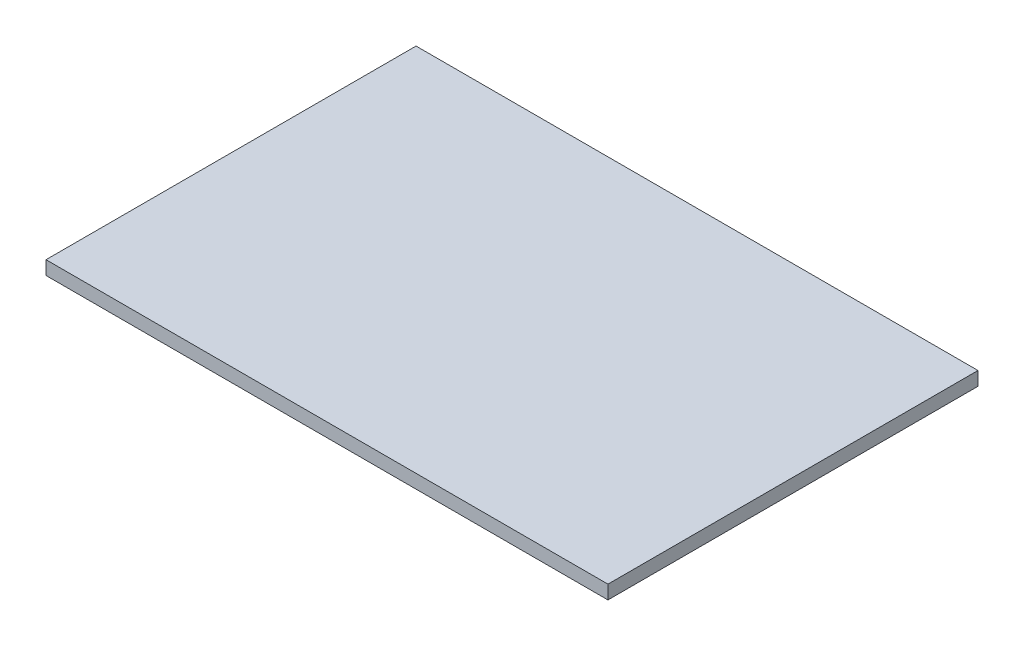
ISO-10303-21;
HEADER;
FILE_DESCRIPTION(('STEP AP214'),'2;1');
FILE_NAME('part.step','',(''),(''),'','','');
FILE_SCHEMA(('AUTOMOTIVE_DESIGN { 1 0 10303 214 1 1 1 1 }'));
ENDSEC;
DATA;
#1=APPLICATION_CONTEXT('core data for automotive mechanical design processes');
#2=APPLICATION_PROTOCOL_DEFINITION('international standard','automotive_design',2000,#1);
#3=PRODUCT_CONTEXT('',#1,'mechanical');
#4=PRODUCT('Part','Part','',(#3));
#5=PRODUCT_RELATED_PRODUCT_CATEGORY('part','',(#4));
#6=PRODUCT_DEFINITION_FORMATION('','',#4);
#7=PRODUCT_DEFINITION_CONTEXT('part definition',#1,'design');
#8=PRODUCT_DEFINITION('design','',#6,#7);
#9=PRODUCT_DEFINITION_SHAPE('','',#8);
#10=(LENGTH_UNIT() NAMED_UNIT(*) SI_UNIT(.MILLI.,.METRE.));
#11=(NAMED_UNIT(*) PLANE_ANGLE_UNIT() SI_UNIT($,.RADIAN.));
#12=(NAMED_UNIT(*) SI_UNIT($,.STERADIAN.) SOLID_ANGLE_UNIT());
#13=UNCERTAINTY_MEASURE_WITH_UNIT(LENGTH_MEASURE(1.E-05),#10,'distance_accuracy_value','');
#14=(GEOMETRIC_REPRESENTATION_CONTEXT(3) GLOBAL_UNCERTAINTY_ASSIGNED_CONTEXT((#13)) GLOBAL_UNIT_ASSIGNED_CONTEXT((#10,
#11,#12)) REPRESENTATION_CONTEXT('',''));
#15=CARTESIAN_POINT('',(0.,0.,0.));
#16=DIRECTION('',(0.,0.,1.));
#17=DIRECTION('',(1.,0.,0.));
#18=AXIS2_PLACEMENT_3D('',#15,#16,#17);
#19=CARTESIAN_POINT('',(-182.71992688712,-4.52441882508929,-124.934414280607));
#20=DIRECTION('',(1.,0.,0.));
#21=DIRECTION('',(0.,0.,-1.));
#22=AXIS2_PLACEMENT_3D('',#19,#20,#21);
#23=PLANE('',#22);
#24=DIRECTION('',(0.,0.,1.));
#25=VECTOR('',#24,1.);
#26=CARTESIAN_POINT('',(-182.71992688712,-24.5244188250893,-124.934414280607));
#27=LINE('',#26,#25);
#28=CARTESIAN_POINT('',(-182.71992688712,-24.5244188250893,-124.934414280607));
#29=VERTEX_POINT('',#28);
#30=CARTESIAN_POINT('',(-182.71992688712,-24.5244188250893,415.065585719393));
#31=VERTEX_POINT('',#30);
#32=EDGE_CURVE('E91',#29,#31,#27,.T.);
#33=ORIENTED_EDGE('',*,*,#32,.T.);
#34=DIRECTION('',(0.,-1.,0.));
#35=VECTOR('',#34,1.);
#36=CARTESIAN_POINT('',(-182.71992688712,-4.52441882508929,415.065585719393));
#37=LINE('',#36,#35);
#38=CARTESIAN_POINT('',(-182.71992688712,-4.52441882508929,415.065585719393));
#39=VERTEX_POINT('',#38);
#40=EDGE_CURVE('E11',#39,#31,#37,.T.);
#41=ORIENTED_EDGE('',*,*,#40,.F.);
#42=DIRECTION('',(0.,0.,1.));
#43=VECTOR('',#42,1.);
#44=CARTESIAN_POINT('',(-182.71992688712,-4.52441882508929,-124.934414280607));
#45=LINE('',#44,#43);
#46=CARTESIAN_POINT('',(-182.71992688712,-4.52441882508929,-124.934414280607));
#47=VERTEX_POINT('',#46);
#48=EDGE_CURVE('E101',#47,#39,#45,.T.);
#49=ORIENTED_EDGE('',*,*,#48,.F.);
#50=DIRECTION('',(0.,-1.,0.));
#51=VECTOR('',#50,1.);
#52=CARTESIAN_POINT('',(-182.71992688712,-4.52441882508929,-124.934414280607));
#53=LINE('',#52,#51);
#54=EDGE_CURVE('E98',#47,#29,#53,.T.);
#55=ORIENTED_EDGE('',*,*,#54,.T.);
#56=EDGE_LOOP('',(#33,#41,#49,#55));
#57=FACE_BOUND('',#56,.T.);
#58=ADVANCED_FACE('F37',(#57),#23,.F.);
#59=CARTESIAN_POINT('',(-182.71992688712,-4.52441882508929,415.065585719393));
#60=DIRECTION('',(0.,0.,-1.));
#61=DIRECTION('',(-1.,0.,0.));
#62=AXIS2_PLACEMENT_3D('',#59,#60,#61);
#63=PLANE('',#62);
#64=DIRECTION('',(1.,0.,0.));
#65=VECTOR('',#64,1.);
#66=CARTESIAN_POINT('',(-182.71992688712,-24.5244188250893,415.065585719393));
#67=LINE('',#66,#65);
#68=CARTESIAN_POINT('',(637.28007311288,-24.5244188250893,415.065585719393));
#69=VERTEX_POINT('',#68);
#70=EDGE_CURVE('E86',#31,#69,#67,.T.);
#71=ORIENTED_EDGE('',*,*,#70,.T.);
#72=DIRECTION('',(0.,-1.,0.));
#73=VECTOR('',#72,1.);
#74=CARTESIAN_POINT('',(637.28007311288,-4.52441882508929,415.065585719393));
#75=LINE('',#74,#73);
#76=CARTESIAN_POINT('',(637.28007311288,-4.52441882508929,415.065585719393));
#77=VERTEX_POINT('',#76);
#78=EDGE_CURVE('E46',#77,#69,#75,.T.);
#79=ORIENTED_EDGE('',*,*,#78,.F.);
#80=DIRECTION('',(1.,0.,0.));
#81=VECTOR('',#80,1.);
#82=CARTESIAN_POINT('',(-182.71992688712,-4.52441882508929,415.065585719393));
#83=LINE('',#82,#81);
#84=EDGE_CURVE('E95',#39,#77,#83,.T.);
#85=ORIENTED_EDGE('',*,*,#84,.F.);
#86=ORIENTED_EDGE('',*,*,#40,.T.);
#87=EDGE_LOOP('',(#71,#79,#85,#86));
#88=FACE_BOUND('',#87,.T.);
#89=ADVANCED_FACE('F94',(#88),#63,.F.);
#90=CARTESIAN_POINT('',(637.28007311288,-4.52441882508929,-124.934414280607));
#91=DIRECTION('',(-1.,0.,0.));
#92=DIRECTION('',(0.,0.,1.));
#93=AXIS2_PLACEMENT_3D('',#90,#91,#92);
#94=PLANE('',#93);
#95=DIRECTION('',(0.,0.,-1.));
#96=VECTOR('',#95,1.);
#97=CARTESIAN_POINT('',(637.28007311288,-24.5244188250893,-124.934414280607));
#98=LINE('',#97,#96);
#99=CARTESIAN_POINT('',(637.28007311288,-24.5244188250893,-124.934414280607));
#100=VERTEX_POINT('',#99);
#101=EDGE_CURVE('E79',#69,#100,#98,.T.);
#102=ORIENTED_EDGE('',*,*,#101,.T.);
#103=DIRECTION('',(0.,-1.,0.));
#104=VECTOR('',#103,1.);
#105=CARTESIAN_POINT('',(637.28007311288,-4.52441882508929,-124.934414280607));
#106=LINE('',#105,#104);
#107=CARTESIAN_POINT('',(637.28007311288,-4.52441882508929,-124.934414280607));
#108=VERTEX_POINT('',#107);
#109=EDGE_CURVE('E103',#108,#100,#106,.T.);
#110=ORIENTED_EDGE('',*,*,#109,.F.);
#111=DIRECTION('',(0.,0.,-1.));
#112=VECTOR('',#111,1.);
#113=CARTESIAN_POINT('',(637.28007311288,-4.52441882508929,-124.934414280607));
#114=LINE('',#113,#112);
#115=EDGE_CURVE('E59',#77,#108,#114,.T.);
#116=ORIENTED_EDGE('',*,*,#115,.F.);
#117=ORIENTED_EDGE('',*,*,#78,.T.);
#118=EDGE_LOOP('',(#102,#110,#116,#117));
#119=FACE_BOUND('',#118,.T.);
#120=ADVANCED_FACE('F110',(#119),#94,.F.);
#121=CARTESIAN_POINT('',(-182.71992688712,-4.52441882508929,-124.934414280607));
#122=DIRECTION('',(0.,0.,1.));
#123=DIRECTION('',(1.,0.,0.));
#124=AXIS2_PLACEMENT_3D('',#121,#122,#123);
#125=PLANE('',#124);
#126=DIRECTION('',(-1.,0.,0.));
#127=VECTOR('',#126,1.);
#128=CARTESIAN_POINT('',(-182.71992688712,-24.5244188250893,-124.934414280607));
#129=LINE('',#128,#127);
#130=EDGE_CURVE('E70',#100,#29,#129,.T.);
#131=ORIENTED_EDGE('',*,*,#130,.T.);
#132=ORIENTED_EDGE('',*,*,#54,.F.);
#133=DIRECTION('',(-1.,0.,0.));
#134=VECTOR('',#133,1.);
#135=CARTESIAN_POINT('',(-182.71992688712,-4.52441882508929,-124.934414280607));
#136=LINE('',#135,#134);
#137=EDGE_CURVE('E41',#108,#47,#136,.T.);
#138=ORIENTED_EDGE('',*,*,#137,.F.);
#139=ORIENTED_EDGE('',*,*,#109,.T.);
#140=EDGE_LOOP('',(#131,#132,#138,#139));
#141=FACE_BOUND('',#140,.T.);
#142=ADVANCED_FACE('F109',(#141),#125,.F.);
#143=CARTESIAN_POINT('',(747.423958004966,-4.52441882508929,-124.934414280607));
#144=DIRECTION('',(0.,1.,0.));
#145=DIRECTION('',(0.,0.,1.));
#146=AXIS2_PLACEMENT_3D('',#143,#144,#145);
#147=PLANE('',#146);
#148=ORIENTED_EDGE('',*,*,#48,.T.);
#149=ORIENTED_EDGE('',*,*,#84,.T.);
#150=ORIENTED_EDGE('',*,*,#115,.T.);
#151=ORIENTED_EDGE('',*,*,#137,.T.);
#152=EDGE_LOOP('',(#148,#149,#150,#151));
#153=FACE_BOUND('',#152,.T.);
#154=ADVANCED_FACE('F117',(#153),#147,.T.);
#155=CARTESIAN_POINT('',(747.423958004966,-24.5244188250893,-124.934414280607));
#156=DIRECTION('',(0.,1.,0.));
#157=DIRECTION('',(0.,0.,1.));
#158=AXIS2_PLACEMENT_3D('',#155,#156,#157);
#159=PLANE('',#158);
#160=ORIENTED_EDGE('',*,*,#32,.F.);
#161=ORIENTED_EDGE('',*,*,#130,.F.);
#162=ORIENTED_EDGE('',*,*,#101,.F.);
#163=ORIENTED_EDGE('',*,*,#70,.F.);
#164=EDGE_LOOP('',(#160,#161,#162,#163));
#165=FACE_BOUND('',#164,.T.);
#166=ADVANCED_FACE('F39',(#165),#159,.F.);
#167=CLOSED_SHELL('',(#58,#89,#120,#142,#154,#166));
#168=MANIFOLD_SOLID_BREP('B2',#167);
#169=ADVANCED_BREP_SHAPE_REPRESENTATION('',(#18,#168),#14);
#170=SHAPE_DEFINITION_REPRESENTATION(#9,#169);
ENDSEC;
END-ISO-10303-21;
